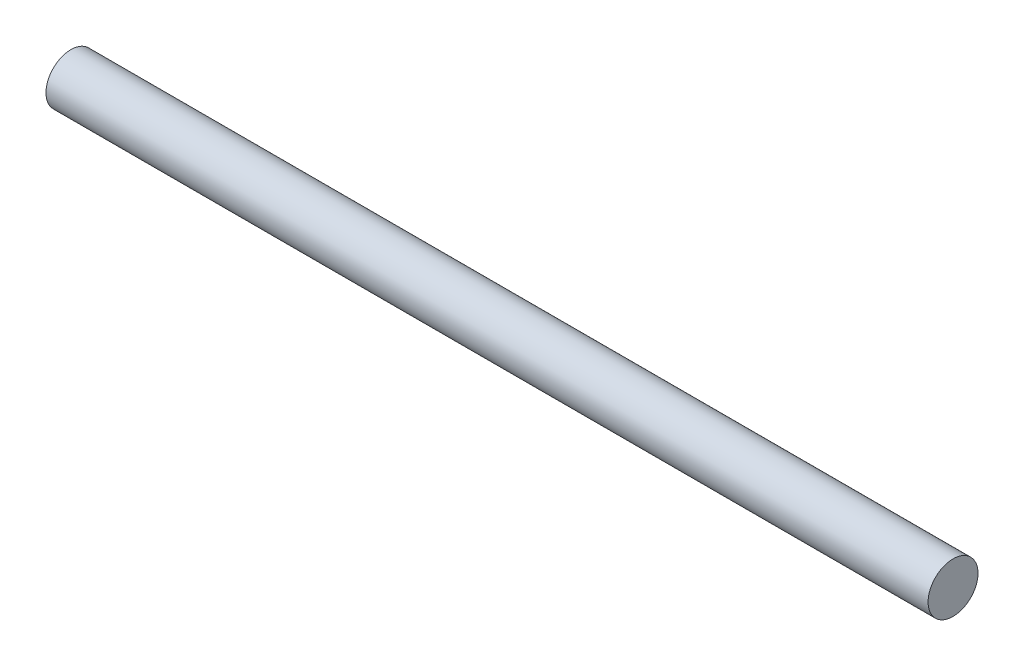
ISO-10303-21;
HEADER;
FILE_DESCRIPTION(('STEP AP214'),'2;1');
FILE_NAME('part.step','',(''),(''),'','','');
FILE_SCHEMA(('AUTOMOTIVE_DESIGN { 1 0 10303 214 1 1 1 1 }'));
ENDSEC;
DATA;
#1=APPLICATION_CONTEXT('core data for automotive mechanical design processes');
#2=APPLICATION_PROTOCOL_DEFINITION('international standard','automotive_design',2000,#1);
#3=PRODUCT_CONTEXT('',#1,'mechanical');
#4=PRODUCT('Part','Part','',(#3));
#5=PRODUCT_RELATED_PRODUCT_CATEGORY('part','',(#4));
#6=PRODUCT_DEFINITION_FORMATION('','',#4);
#7=PRODUCT_DEFINITION_CONTEXT('part definition',#1,'design');
#8=PRODUCT_DEFINITION('design','',#6,#7);
#9=PRODUCT_DEFINITION_SHAPE('','',#8);
#10=(LENGTH_UNIT() NAMED_UNIT(*) SI_UNIT(.MILLI.,.METRE.));
#11=(NAMED_UNIT(*) PLANE_ANGLE_UNIT() SI_UNIT($,.RADIAN.));
#12=(NAMED_UNIT(*) SI_UNIT($,.STERADIAN.) SOLID_ANGLE_UNIT());
#13=UNCERTAINTY_MEASURE_WITH_UNIT(LENGTH_MEASURE(1.E-05),#10,'distance_accuracy_value','');
#14=(GEOMETRIC_REPRESENTATION_CONTEXT(3) GLOBAL_UNCERTAINTY_ASSIGNED_CONTEXT((#13)) GLOBAL_UNIT_ASSIGNED_CONTEXT((#10,
#11,#12)) REPRESENTATION_CONTEXT('',''));
#15=CARTESIAN_POINT('',(0.,0.,0.));
#16=DIRECTION('',(0.,0.,1.));
#17=DIRECTION('',(1.,0.,0.));
#18=AXIS2_PLACEMENT_3D('',#15,#16,#17);
#19=CARTESIAN_POINT('',(53.,0.,0.));
#20=DIRECTION('',(-1.,0.,0.));
#21=DIRECTION('',(0.,0.,1.));
#22=AXIS2_PLACEMENT_3D('',#19,#20,#21);
#23=CYLINDRICAL_SURFACE('',#22,3.);
#24=CARTESIAN_POINT('',(53.,0.,0.));
#25=DIRECTION('',(1.,0.,0.));
#26=DIRECTION('',(0.,0.,-1.));
#27=AXIS2_PLACEMENT_3D('',#24,#25,#26);
#28=CIRCLE('',#27,3.);
#29=CARTESIAN_POINT('',(53.,0.,-3.));
#30=VERTEX_POINT('',#29);
#31=EDGE_CURVE('E10',#30,#30,#28,.T.);
#32=ORIENTED_EDGE('',*,*,#31,.F.);
#33=EDGE_LOOP('',(#32));
#34=FACE_BOUND('',#33,.T.);
#35=CARTESIAN_POINT('',(-53.,0.,0.));
#36=DIRECTION('',(1.,0.,0.));
#37=DIRECTION('',(0.,0.,-1.));
#38=AXIS2_PLACEMENT_3D('',#35,#36,#37);
#39=CIRCLE('',#38,3.);
#40=CARTESIAN_POINT('',(-53.,0.,-3.));
#41=VERTEX_POINT('',#40);
#42=EDGE_CURVE('E36',#41,#41,#39,.T.);
#43=ORIENTED_EDGE('',*,*,#42,.T.);
#44=EDGE_LOOP('',(#43));
#45=FACE_BOUND('',#44,.T.);
#46=ADVANCED_FACE('F33',(#34,#45),#23,.T.);
#47=CARTESIAN_POINT('',(53.,0.,0.));
#48=DIRECTION('',(1.,0.,0.));
#49=DIRECTION('',(0.,0.,-1.));
#50=AXIS2_PLACEMENT_3D('',#47,#48,#49);
#51=PLANE('',#50);
#52=ORIENTED_EDGE('',*,*,#31,.T.);
#53=EDGE_LOOP('',(#52));
#54=FACE_BOUND('',#53,.T.);
#55=ADVANCED_FACE('F48',(#54),#51,.T.);
#56=CARTESIAN_POINT('',(-53.,0.,0.));
#57=DIRECTION('',(1.,0.,0.));
#58=DIRECTION('',(0.,0.,-1.));
#59=AXIS2_PLACEMENT_3D('',#56,#57,#58);
#60=PLANE('',#59);
#61=ORIENTED_EDGE('',*,*,#42,.F.);
#62=EDGE_LOOP('',(#61));
#63=FACE_BOUND('',#62,.T.);
#64=ADVANCED_FACE('F46',(#63),#60,.F.);
#65=CLOSED_SHELL('',(#46,#55,#64));
#66=MANIFOLD_SOLID_BREP('B2',#65);
#67=ADVANCED_BREP_SHAPE_REPRESENTATION('',(#18,#66),#14);
#68=SHAPE_DEFINITION_REPRESENTATION(#9,#67);
ENDSEC;
END-ISO-10303-21;
